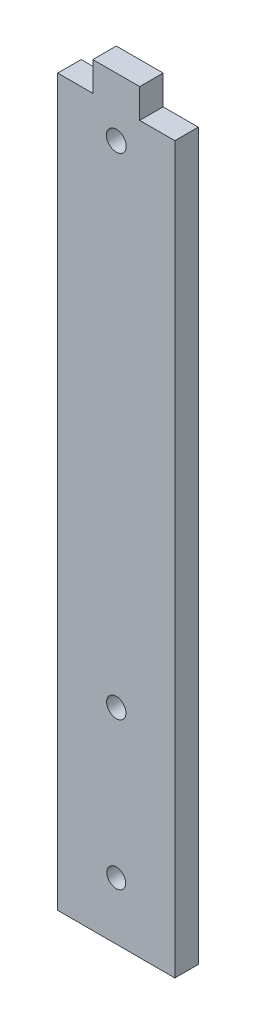
ISO-10303-21;
HEADER;
FILE_DESCRIPTION(('STEP AP214'),'2;1');
FILE_NAME('part.step','',(''),(''),'','','');
FILE_SCHEMA(('AUTOMOTIVE_DESIGN { 1 0 10303 214 1 1 1 1 }'));
ENDSEC;
DATA;
#1=APPLICATION_CONTEXT('core data for automotive mechanical design processes');
#2=APPLICATION_PROTOCOL_DEFINITION('international standard','automotive_design',2000,#1);
#3=PRODUCT_CONTEXT('',#1,'mechanical');
#4=PRODUCT('Part','Part','',(#3));
#5=PRODUCT_RELATED_PRODUCT_CATEGORY('part','',(#4));
#6=PRODUCT_DEFINITION_FORMATION('','',#4);
#7=PRODUCT_DEFINITION_CONTEXT('part definition',#1,'design');
#8=PRODUCT_DEFINITION('design','',#6,#7);
#9=PRODUCT_DEFINITION_SHAPE('','',#8);
#10=(LENGTH_UNIT() NAMED_UNIT(*) SI_UNIT(.MILLI.,.METRE.));
#11=(NAMED_UNIT(*) PLANE_ANGLE_UNIT() SI_UNIT($,.RADIAN.));
#12=(NAMED_UNIT(*) SI_UNIT($,.STERADIAN.) SOLID_ANGLE_UNIT());
#13=UNCERTAINTY_MEASURE_WITH_UNIT(LENGTH_MEASURE(1.E-05),#10,'distance_accuracy_value','');
#14=(GEOMETRIC_REPRESENTATION_CONTEXT(3) GLOBAL_UNCERTAINTY_ASSIGNED_CONTEXT((#13)) GLOBAL_UNIT_ASSIGNED_CONTEXT((#10,
#11,#12)) REPRESENTATION_CONTEXT('',''));
#15=CARTESIAN_POINT('',(0.,0.,0.));
#16=DIRECTION('',(0.,0.,1.));
#17=DIRECTION('',(1.,0.,0.));
#18=AXIS2_PLACEMENT_3D('',#15,#16,#17);
#19=CARTESIAN_POINT('',(20.,0.,4.));
#20=DIRECTION('',(0.,-1.,0.));
#21=DIRECTION('',(0.,0.,-1.));
#22=AXIS2_PLACEMENT_3D('',#19,#20,#21);
#23=PLANE('',#22);
#24=DIRECTION('',(0.,0.,1.));
#25=VECTOR('',#24,1.);
#26=CARTESIAN_POINT('',(6.,0.,-9.4339811320566));
#27=LINE('',#26,#25);
#28=CARTESIAN_POINT('',(6.,0.,0.));
#29=VERTEX_POINT('',#28);
#30=CARTESIAN_POINT('',(6.,0.,4.));
#31=VERTEX_POINT('',#30);
#32=EDGE_CURVE('E129',#29,#31,#27,.T.);
#33=ORIENTED_EDGE('',*,*,#32,.F.);
#34=DIRECTION('',(1.,0.,0.));
#35=VECTOR('',#34,1.);
#36=CARTESIAN_POINT('',(20.,0.,0.));
#37=LINE('',#36,#35);
#38=CARTESIAN_POINT('',(0.,0.,0.));
#39=VERTEX_POINT('',#38);
#40=EDGE_CURVE('E175',#39,#29,#37,.T.);
#41=ORIENTED_EDGE('',*,*,#40,.F.);
#42=DIRECTION('',(0.,0.,1.));
#43=VECTOR('',#42,1.);
#44=CARTESIAN_POINT('',(0.,0.,-6.));
#45=LINE('',#44,#43);
#46=CARTESIAN_POINT('',(0.,0.,4.));
#47=VERTEX_POINT('',#46);
#48=EDGE_CURVE('E141',#39,#47,#45,.T.);
#49=ORIENTED_EDGE('',*,*,#48,.T.);
#50=DIRECTION('',(1.,0.,0.));
#51=VECTOR('',#50,1.);
#52=CARTESIAN_POINT('',(0.,0.,4.));
#53=LINE('',#52,#51);
#54=EDGE_CURVE('E174',#31,#47,#53,.F.);
#55=ORIENTED_EDGE('',*,*,#54,.F.);
#56=EDGE_LOOP('',(#33,#41,#49,#55));
#57=FACE_BOUND('',#56,.T.);
#58=ADVANCED_FACE('F34',(#57),#23,.F.);
#59=CARTESIAN_POINT('',(0.,0.,0.));
#60=DIRECTION('',(0.,0.,1.));
#61=DIRECTION('',(1.,0.,0.));
#62=AXIS2_PLACEMENT_3D('',#59,#60,#61);
#63=PLANE('',#62);
#64=CARTESIAN_POINT('',(10.,-88.82,0.));
#65=DIRECTION('',(0.,0.,1.));
#66=DIRECTION('',(1.,0.,0.));
#67=AXIS2_PLACEMENT_3D('',#64,#65,#66);
#68=CIRCLE('',#67,1.65);
#69=CARTESIAN_POINT('',(11.65,-88.82,0.));
#70=VERTEX_POINT('',#69);
#71=EDGE_CURVE('E140',#70,#70,#68,.T.);
#72=ORIENTED_EDGE('',*,*,#71,.T.);
#73=EDGE_LOOP('',(#72));
#74=FACE_BOUND('',#73,.T.);
#75=ORIENTED_EDGE('',*,*,#40,.T.);
#76=DIRECTION('',(0.,1.,0.));
#77=VECTOR('',#76,1.);
#78=CARTESIAN_POINT('',(6.,0.,0.));
#79=LINE('',#78,#77);
#80=CARTESIAN_POINT('',(6.,5.,0.));
#81=VERTEX_POINT('',#80);
#82=EDGE_CURVE('E125',#29,#81,#79,.T.);
#83=ORIENTED_EDGE('',*,*,#82,.T.);
#84=DIRECTION('',(1.,0.,0.));
#85=VECTOR('',#84,1.);
#86=CARTESIAN_POINT('',(6.,5.,0.));
#87=LINE('',#86,#85);
#88=CARTESIAN_POINT('',(14.,5.,0.));
#89=VERTEX_POINT('',#88);
#90=EDGE_CURVE('E132',#81,#89,#87,.T.);
#91=ORIENTED_EDGE('',*,*,#90,.T.);
#92=DIRECTION('',(0.,-1.,0.));
#93=VECTOR('',#92,1.);
#94=CARTESIAN_POINT('',(14.,5.,0.));
#95=LINE('',#94,#93);
#96=CARTESIAN_POINT('',(14.,0.,0.));
#97=VERTEX_POINT('',#96);
#98=EDGE_CURVE('E106',#89,#97,#95,.T.);
#99=ORIENTED_EDGE('',*,*,#98,.T.);
#100=CARTESIAN_POINT('',(20.,0.,0.));
#101=VERTEX_POINT('',#100);
#102=EDGE_CURVE('E56',#97,#101,#37,.T.);
#103=ORIENTED_EDGE('',*,*,#102,.T.);
#104=DIRECTION('',(0.,1.,0.));
#105=VECTOR('',#104,1.);
#106=CARTESIAN_POINT('',(20.,-124.,0.));
#107=LINE('',#106,#105);
#108=CARTESIAN_POINT('',(20.,-123.82,0.));
#109=VERTEX_POINT('',#108);
#110=EDGE_CURVE('E171',#101,#109,#107,.F.);
#111=ORIENTED_EDGE('',*,*,#110,.T.);
#112=DIRECTION('',(1.,0.,0.));
#113=VECTOR('',#112,1.);
#114=CARTESIAN_POINT('',(20.,-123.82,0.));
#115=LINE('',#114,#113);
#116=CARTESIAN_POINT('',(0.,-123.82,0.));
#117=VERTEX_POINT('',#116);
#118=EDGE_CURVE('E148',#117,#109,#115,.T.);
#119=ORIENTED_EDGE('',*,*,#118,.F.);
#120=DIRECTION('',(0.,1.,0.));
#121=VECTOR('',#120,1.);
#122=CARTESIAN_POINT('',(0.,0.,0.));
#123=LINE('',#122,#121);
#124=EDGE_CURVE('E38',#117,#39,#123,.T.);
#125=ORIENTED_EDGE('',*,*,#124,.T.);
#126=EDGE_LOOP('',(#75,#83,#91,#99,#103,#111,#119,#125));
#127=FACE_BOUND('',#126,.T.);
#128=CARTESIAN_POINT('',(9.99999999999974,-4.99999999999974,0.));
#129=DIRECTION('',(0.,0.,1.));
#130=DIRECTION('',(1.,0.,0.));
#131=AXIS2_PLACEMENT_3D('',#128,#129,#130);
#132=CIRCLE('',#131,1.7);
#133=CARTESIAN_POINT('',(11.6999999999997,-4.99999999999974,0.));
#134=VERTEX_POINT('',#133);
#135=EDGE_CURVE('E164',#134,#134,#132,.T.);
#136=ORIENTED_EDGE('',*,*,#135,.T.);
#137=EDGE_LOOP('',(#136));
#138=FACE_BOUND('',#137,.T.);
#139=CARTESIAN_POINT('',(10.,-114.,0.));
#140=DIRECTION('',(0.,0.,1.));
#141=DIRECTION('',(1.,0.,0.));
#142=AXIS2_PLACEMENT_3D('',#139,#140,#141);
#143=CIRCLE('',#142,1.6);
#144=CARTESIAN_POINT('',(11.6,-114.,0.));
#145=VERTEX_POINT('',#144);
#146=EDGE_CURVE('E154',#145,#145,#143,.T.);
#147=ORIENTED_EDGE('',*,*,#146,.T.);
#148=EDGE_LOOP('',(#147));
#149=FACE_BOUND('',#148,.T.);
#150=ADVANCED_FACE('F36',(#74,#127,#138,#149),#63,.F.);
#151=CARTESIAN_POINT('',(10.,-114.,0.));
#152=DIRECTION('',(0.,0.,1.));
#153=DIRECTION('',(1.,0.,0.));
#154=AXIS2_PLACEMENT_3D('',#151,#152,#153);
#155=CYLINDRICAL_SURFACE('',#154,1.6);
#156=CARTESIAN_POINT('',(10.,-114.,4.));
#157=DIRECTION('',(0.,0.,1.));
#158=DIRECTION('',(1.,0.,0.));
#159=AXIS2_PLACEMENT_3D('',#156,#157,#158);
#160=CIRCLE('',#159,1.6);
#161=CARTESIAN_POINT('',(11.6,-114.,4.));
#162=VERTEX_POINT('',#161);
#163=EDGE_CURVE('E167',#162,#162,#160,.F.);
#164=ORIENTED_EDGE('',*,*,#163,.F.);
#165=EDGE_LOOP('',(#164));
#166=FACE_BOUND('',#165,.T.);
#167=ORIENTED_EDGE('',*,*,#146,.F.);
#168=EDGE_LOOP('',(#167));
#169=FACE_BOUND('',#168,.T.);
#170=ADVANCED_FACE('F213',(#166,#169),#155,.F.);
#171=CARTESIAN_POINT('',(9.99999999999974,-4.99999999999974,0.));
#172=DIRECTION('',(0.,0.,1.));
#173=DIRECTION('',(1.,0.,0.));
#174=AXIS2_PLACEMENT_3D('',#171,#172,#173);
#175=CYLINDRICAL_SURFACE('',#174,1.7);
#176=CARTESIAN_POINT('',(9.99999999999974,-4.99999999999974,4.));
#177=DIRECTION('',(0.,0.,1.));
#178=DIRECTION('',(1.,0.,0.));
#179=AXIS2_PLACEMENT_3D('',#176,#177,#178);
#180=CIRCLE('',#179,1.7);
#181=CARTESIAN_POINT('',(11.6999999999997,-4.99999999999974,4.));
#182=VERTEX_POINT('',#181);
#183=EDGE_CURVE('E170',#182,#182,#180,.F.);
#184=ORIENTED_EDGE('',*,*,#183,.F.);
#185=EDGE_LOOP('',(#184));
#186=FACE_BOUND('',#185,.T.);
#187=ORIENTED_EDGE('',*,*,#135,.F.);
#188=EDGE_LOOP('',(#187));
#189=FACE_BOUND('',#188,.T.);
#190=ADVANCED_FACE('F206',(#186,#189),#175,.F.);
#191=ORIENTED_EDGE('',*,*,#102,.F.);
#192=DIRECTION('',(0.,0.,1.));
#193=VECTOR('',#192,1.);
#194=CARTESIAN_POINT('',(14.,0.,-9.4339811320566));
#195=LINE('',#194,#193);
#196=CARTESIAN_POINT('',(14.,0.,4.));
#197=VERTEX_POINT('',#196);
#198=EDGE_CURVE('E51',#97,#197,#195,.T.);
#199=ORIENTED_EDGE('',*,*,#198,.T.);
#200=CARTESIAN_POINT('',(20.,0.,4.));
#201=VERTEX_POINT('',#200);
#202=EDGE_CURVE('E122',#201,#197,#53,.F.);
#203=ORIENTED_EDGE('',*,*,#202,.F.);
#204=DIRECTION('',(0.,0.,1.));
#205=VECTOR('',#204,1.);
#206=CARTESIAN_POINT('',(20.,0.,-6.));
#207=LINE('',#206,#205);
#208=EDGE_CURVE('E137',#101,#201,#207,.T.);
#209=ORIENTED_EDGE('',*,*,#208,.F.);
#210=EDGE_LOOP('',(#191,#199,#203,#209));
#211=FACE_BOUND('',#210,.T.);
#212=ADVANCED_FACE('F204',(#211),#23,.F.);
#213=CARTESIAN_POINT('',(0.,0.,4.));
#214=DIRECTION('',(1.,0.,0.));
#215=DIRECTION('',(0.,0.,-1.));
#216=AXIS2_PLACEMENT_3D('',#213,#214,#215);
#217=PLANE('',#216);
#218=ORIENTED_EDGE('',*,*,#124,.F.);
#219=DIRECTION('',(0.,0.,-1.));
#220=VECTOR('',#219,1.);
#221=CARTESIAN_POINT('',(0.,-123.82,10.));
#222=LINE('',#221,#220);
#223=CARTESIAN_POINT('',(0.,-123.82,4.));
#224=VERTEX_POINT('',#223);
#225=EDGE_CURVE('E150',#224,#117,#222,.T.);
#226=ORIENTED_EDGE('',*,*,#225,.F.);
#227=DIRECTION('',(0.,1.,0.));
#228=VECTOR('',#227,1.);
#229=CARTESIAN_POINT('',(0.,0.,4.));
#230=LINE('',#229,#228);
#231=EDGE_CURVE('E158',#47,#224,#230,.F.);
#232=ORIENTED_EDGE('',*,*,#231,.F.);
#233=ORIENTED_EDGE('',*,*,#48,.F.);
#234=EDGE_LOOP('',(#218,#226,#232,#233));
#235=FACE_BOUND('',#234,.T.);
#236=ADVANCED_FACE('F192',(#235),#217,.F.);
#237=CARTESIAN_POINT('',(20.,-124.,4.));
#238=DIRECTION('',(-1.,0.,0.));
#239=DIRECTION('',(0.,0.,1.));
#240=AXIS2_PLACEMENT_3D('',#237,#238,#239);
#241=PLANE('',#240);
#242=DIRECTION('',(0.,1.,0.));
#243=VECTOR('',#242,1.);
#244=CARTESIAN_POINT('',(20.,0.,4.));
#245=LINE('',#244,#243);
#246=CARTESIAN_POINT('',(20.,-123.82,4.));
#247=VERTEX_POINT('',#246);
#248=EDGE_CURVE('E44',#247,#201,#245,.T.);
#249=ORIENTED_EDGE('',*,*,#248,.F.);
#250=DIRECTION('',(0.,0.,-1.));
#251=VECTOR('',#250,1.);
#252=CARTESIAN_POINT('',(20.,-123.82,10.));
#253=LINE('',#252,#251);
#254=EDGE_CURVE('E151',#247,#109,#253,.T.);
#255=ORIENTED_EDGE('',*,*,#254,.T.);
#256=ORIENTED_EDGE('',*,*,#110,.F.);
#257=ORIENTED_EDGE('',*,*,#208,.T.);
#258=EDGE_LOOP('',(#249,#255,#256,#257));
#259=FACE_BOUND('',#258,.T.);
#260=ADVANCED_FACE('F203',(#259),#241,.F.);
#261=CARTESIAN_POINT('',(0.,0.,4.));
#262=DIRECTION('',(0.,0.,1.));
#263=DIRECTION('',(1.,0.,0.));
#264=AXIS2_PLACEMENT_3D('',#261,#262,#263);
#265=PLANE('',#264);
#266=ORIENTED_EDGE('',*,*,#248,.T.);
#267=ORIENTED_EDGE('',*,*,#202,.T.);
#268=DIRECTION('',(0.,1.,0.));
#269=VECTOR('',#268,1.);
#270=CARTESIAN_POINT('',(14.,5.,4.));
#271=LINE('',#270,#269);
#272=CARTESIAN_POINT('',(14.,5.,4.));
#273=VERTEX_POINT('',#272);
#274=EDGE_CURVE('E105',#197,#273,#271,.T.);
#275=ORIENTED_EDGE('',*,*,#274,.T.);
#276=DIRECTION('',(-1.,0.,0.));
#277=VECTOR('',#276,1.);
#278=CARTESIAN_POINT('',(6.,5.,4.));
#279=LINE('',#278,#277);
#280=CARTESIAN_POINT('',(6.,5.,4.));
#281=VERTEX_POINT('',#280);
#282=EDGE_CURVE('E112',#273,#281,#279,.T.);
#283=ORIENTED_EDGE('',*,*,#282,.T.);
#284=DIRECTION('',(0.,-1.,0.));
#285=VECTOR('',#284,1.);
#286=CARTESIAN_POINT('',(6.,0.,4.));
#287=LINE('',#286,#285);
#288=EDGE_CURVE('E118',#281,#31,#287,.T.);
#289=ORIENTED_EDGE('',*,*,#288,.T.);
#290=ORIENTED_EDGE('',*,*,#54,.T.);
#291=ORIENTED_EDGE('',*,*,#231,.T.);
#292=DIRECTION('',(-1.,0.,0.));
#293=VECTOR('',#292,1.);
#294=CARTESIAN_POINT('',(0.,-123.82,4.));
#295=LINE('',#294,#293);
#296=EDGE_CURVE('E11',#247,#224,#295,.T.);
#297=ORIENTED_EDGE('',*,*,#296,.F.);
#298=EDGE_LOOP('',(#266,#267,#275,#283,#289,#290,#291,#297));
#299=FACE_BOUND('',#298,.T.);
#300=CARTESIAN_POINT('',(10.,-88.82,4.));
#301=DIRECTION('',(0.,0.,1.));
#302=DIRECTION('',(1.,0.,0.));
#303=AXIS2_PLACEMENT_3D('',#300,#301,#302);
#304=CIRCLE('',#303,1.65);
#305=CARTESIAN_POINT('',(11.65,-88.82,4.));
#306=VERTEX_POINT('',#305);
#307=EDGE_CURVE('E136',#306,#306,#304,.T.);
#308=ORIENTED_EDGE('',*,*,#307,.F.);
#309=EDGE_LOOP('',(#308));
#310=FACE_BOUND('',#309,.T.);
#311=ORIENTED_EDGE('',*,*,#183,.T.);
#312=EDGE_LOOP('',(#311));
#313=FACE_BOUND('',#312,.T.);
#314=ORIENTED_EDGE('',*,*,#163,.T.);
#315=EDGE_LOOP('',(#314));
#316=FACE_BOUND('',#315,.T.);
#317=ADVANCED_FACE('F120',(#299,#310,#313,#316),#265,.T.);
#318=CARTESIAN_POINT('',(20.,-123.82,10.));
#319=DIRECTION('',(0.,1.,0.));
#320=DIRECTION('',(0.,0.,1.));
#321=AXIS2_PLACEMENT_3D('',#318,#319,#320);
#322=PLANE('',#321);
#323=ORIENTED_EDGE('',*,*,#296,.T.);
#324=ORIENTED_EDGE('',*,*,#225,.T.);
#325=ORIENTED_EDGE('',*,*,#118,.T.);
#326=ORIENTED_EDGE('',*,*,#254,.F.);
#327=EDGE_LOOP('',(#323,#324,#325,#326));
#328=FACE_BOUND('',#327,.T.);
#329=ADVANCED_FACE('F200',(#328),#322,.F.);
#330=CARTESIAN_POINT('',(10.,-88.82,-6.));
#331=DIRECTION('',(0.,0.,1.));
#332=DIRECTION('',(1.,0.,0.));
#333=AXIS2_PLACEMENT_3D('',#330,#331,#332);
#334=CYLINDRICAL_SURFACE('',#333,1.65);
#335=ORIENTED_EDGE('',*,*,#307,.T.);
#336=EDGE_LOOP('',(#335));
#337=FACE_BOUND('',#336,.T.);
#338=ORIENTED_EDGE('',*,*,#71,.F.);
#339=EDGE_LOOP('',(#338));
#340=FACE_BOUND('',#339,.T.);
#341=ADVANCED_FACE('F227',(#337,#340),#334,.F.);
#342=CARTESIAN_POINT('',(6.,0.,-9.4339811320566));
#343=DIRECTION('',(-1.,0.,0.));
#344=DIRECTION('',(0.,-1.,0.));
#345=AXIS2_PLACEMENT_3D('',#342,#343,#344);
#346=PLANE('',#345);
#347=ORIENTED_EDGE('',*,*,#82,.F.);
#348=ORIENTED_EDGE('',*,*,#32,.T.);
#349=ORIENTED_EDGE('',*,*,#288,.F.);
#350=DIRECTION('',(0.,0.,1.));
#351=VECTOR('',#350,1.);
#352=CARTESIAN_POINT('',(6.,5.,-9.4339811320566));
#353=LINE('',#352,#351);
#354=EDGE_CURVE('E109',#81,#281,#353,.T.);
#355=ORIENTED_EDGE('',*,*,#354,.F.);
#356=EDGE_LOOP('',(#347,#348,#349,#355));
#357=FACE_BOUND('',#356,.T.);
#358=ADVANCED_FACE('F233',(#357),#346,.T.);
#359=CARTESIAN_POINT('',(6.,5.,-9.4339811320566));
#360=DIRECTION('',(0.,1.,0.));
#361=DIRECTION('',(0.,0.,1.));
#362=AXIS2_PLACEMENT_3D('',#359,#360,#361);
#363=PLANE('',#362);
#364=ORIENTED_EDGE('',*,*,#90,.F.);
#365=ORIENTED_EDGE('',*,*,#354,.T.);
#366=ORIENTED_EDGE('',*,*,#282,.F.);
#367=DIRECTION('',(0.,0.,1.));
#368=VECTOR('',#367,1.);
#369=CARTESIAN_POINT('',(14.,5.,-9.4339811320566));
#370=LINE('',#369,#368);
#371=EDGE_CURVE('E101',#89,#273,#370,.T.);
#372=ORIENTED_EDGE('',*,*,#371,.F.);
#373=EDGE_LOOP('',(#364,#365,#366,#372));
#374=FACE_BOUND('',#373,.T.);
#375=ADVANCED_FACE('F113',(#374),#363,.T.);
#376=CARTESIAN_POINT('',(14.,5.,-9.4339811320566));
#377=DIRECTION('',(1.,0.,0.));
#378=DIRECTION('',(0.,1.,0.));
#379=AXIS2_PLACEMENT_3D('',#376,#377,#378);
#380=PLANE('',#379);
#381=ORIENTED_EDGE('',*,*,#98,.F.);
#382=ORIENTED_EDGE('',*,*,#371,.T.);
#383=ORIENTED_EDGE('',*,*,#274,.F.);
#384=ORIENTED_EDGE('',*,*,#198,.F.);
#385=EDGE_LOOP('',(#381,#382,#383,#384));
#386=FACE_BOUND('',#385,.T.);
#387=ADVANCED_FACE('F103',(#386),#380,.T.);
#388=CLOSED_SHELL('',(#58,#150,#170,#190,#212,#236,#260,#317,#329,#341,#358,#375,#387));
#389=MANIFOLD_SOLID_BREP('B2',#388);
#390=ADVANCED_BREP_SHAPE_REPRESENTATION('',(#18,#389),#14);
#391=SHAPE_DEFINITION_REPRESENTATION(#9,#390);
ENDSEC;
END-ISO-10303-21;
